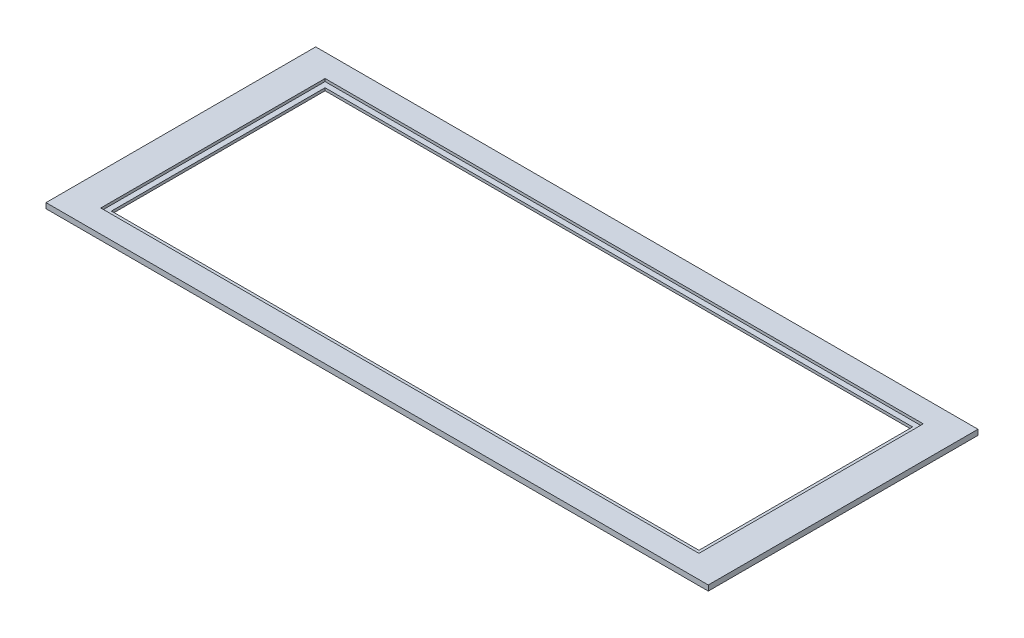
ISO-10303-21;
HEADER;
FILE_DESCRIPTION(('STEP AP214'),'2;1');
FILE_NAME('part.step','',(''),(''),'','','');
FILE_SCHEMA(('AUTOMOTIVE_DESIGN { 1 0 10303 214 1 1 1 1 }'));
ENDSEC;
DATA;
#1=APPLICATION_CONTEXT('core data for automotive mechanical design processes');
#2=APPLICATION_PROTOCOL_DEFINITION('international standard','automotive_design',2000,#1);
#3=PRODUCT_CONTEXT('',#1,'mechanical');
#4=PRODUCT('Part','Part','',(#3));
#5=PRODUCT_RELATED_PRODUCT_CATEGORY('part','',(#4));
#6=PRODUCT_DEFINITION_FORMATION('','',#4);
#7=PRODUCT_DEFINITION_CONTEXT('part definition',#1,'design');
#8=PRODUCT_DEFINITION('design','',#6,#7);
#9=PRODUCT_DEFINITION_SHAPE('','',#8);
#10=(LENGTH_UNIT() NAMED_UNIT(*) SI_UNIT(.MILLI.,.METRE.));
#11=(NAMED_UNIT(*) PLANE_ANGLE_UNIT() SI_UNIT($,.RADIAN.));
#12=(NAMED_UNIT(*) SI_UNIT($,.STERADIAN.) SOLID_ANGLE_UNIT());
#13=UNCERTAINTY_MEASURE_WITH_UNIT(LENGTH_MEASURE(1.E-05),#10,'distance_accuracy_value','');
#14=(GEOMETRIC_REPRESENTATION_CONTEXT(3) GLOBAL_UNCERTAINTY_ASSIGNED_CONTEXT((#13)) GLOBAL_UNIT_ASSIGNED_CONTEXT((#10,
#11,#12)) REPRESENTATION_CONTEXT('',''));
#15=CARTESIAN_POINT('',(0.,0.,0.));
#16=DIRECTION('',(0.,0.,1.));
#17=DIRECTION('',(1.,0.,0.));
#18=AXIS2_PLACEMENT_3D('',#15,#16,#17);
#19=CARTESIAN_POINT('',(-620.,10.,-252.5));
#20=DIRECTION('',(1.,0.,0.));
#21=DIRECTION('',(0.,0.,-1.));
#22=AXIS2_PLACEMENT_3D('',#19,#20,#21);
#23=PLANE('',#22);
#24=DIRECTION('',(0.,0.,1.));
#25=VECTOR('',#24,1.);
#26=CARTESIAN_POINT('',(-620.,0.,-252.5));
#27=LINE('',#26,#25);
#28=CARTESIAN_POINT('',(-620.,0.,-252.5));
#29=VERTEX_POINT('',#28);
#30=CARTESIAN_POINT('',(-620.,0.,252.5));
#31=VERTEX_POINT('',#30);
#32=EDGE_CURVE('E207',#29,#31,#27,.T.);
#33=ORIENTED_EDGE('',*,*,#32,.T.);
#34=DIRECTION('',(0.,-1.,0.));
#35=VECTOR('',#34,1.);
#36=CARTESIAN_POINT('',(-620.,10.,252.5));
#37=LINE('',#36,#35);
#38=CARTESIAN_POINT('',(-620.,10.,252.5));
#39=VERTEX_POINT('',#38);
#40=EDGE_CURVE('E46',#39,#31,#37,.T.);
#41=ORIENTED_EDGE('',*,*,#40,.F.);
#42=DIRECTION('',(0.,0.,1.));
#43=VECTOR('',#42,1.);
#44=CARTESIAN_POINT('',(-620.,10.,-252.5));
#45=LINE('',#44,#43);
#46=CARTESIAN_POINT('',(-620.,10.,-252.5));
#47=VERTEX_POINT('',#46);
#48=EDGE_CURVE('E219',#47,#39,#45,.T.);
#49=ORIENTED_EDGE('',*,*,#48,.F.);
#50=DIRECTION('',(0.,-1.,0.));
#51=VECTOR('',#50,1.);
#52=CARTESIAN_POINT('',(-620.,10.,-252.5));
#53=LINE('',#52,#51);
#54=EDGE_CURVE('E233',#47,#29,#53,.T.);
#55=ORIENTED_EDGE('',*,*,#54,.T.);
#56=EDGE_LOOP('',(#33,#41,#49,#55));
#57=FACE_BOUND('',#56,.T.);
#58=ADVANCED_FACE('F38',(#57),#23,.F.);
#59=CARTESIAN_POINT('',(620.,10.,252.5));
#60=DIRECTION('',(0.,0.,-1.));
#61=DIRECTION('',(-1.,0.,0.));
#62=AXIS2_PLACEMENT_3D('',#59,#60,#61);
#63=PLANE('',#62);
#64=DIRECTION('',(1.,0.,0.));
#65=VECTOR('',#64,1.);
#66=CARTESIAN_POINT('',(620.,0.,252.5));
#67=LINE('',#66,#65);
#68=CARTESIAN_POINT('',(620.,0.,252.5));
#69=VERTEX_POINT('',#68);
#70=EDGE_CURVE('E237',#31,#69,#67,.T.);
#71=ORIENTED_EDGE('',*,*,#70,.T.);
#72=DIRECTION('',(0.,-1.,0.));
#73=VECTOR('',#72,1.);
#74=CARTESIAN_POINT('',(620.,10.,252.5));
#75=LINE('',#74,#73);
#76=CARTESIAN_POINT('',(620.,10.,252.5));
#77=VERTEX_POINT('',#76);
#78=EDGE_CURVE('E252',#77,#69,#75,.T.);
#79=ORIENTED_EDGE('',*,*,#78,.F.);
#80=DIRECTION('',(1.,0.,0.));
#81=VECTOR('',#80,1.);
#82=CARTESIAN_POINT('',(620.,10.,252.5));
#83=LINE('',#82,#81);
#84=EDGE_CURVE('E223',#39,#77,#83,.T.);
#85=ORIENTED_EDGE('',*,*,#84,.F.);
#86=ORIENTED_EDGE('',*,*,#40,.T.);
#87=EDGE_LOOP('',(#71,#79,#85,#86));
#88=FACE_BOUND('',#87,.T.);
#89=ADVANCED_FACE('F259',(#88),#63,.F.);
#90=CARTESIAN_POINT('',(620.,10.,-252.5));
#91=DIRECTION('',(-1.,0.,0.));
#92=DIRECTION('',(0.,0.,1.));
#93=AXIS2_PLACEMENT_3D('',#90,#91,#92);
#94=PLANE('',#93);
#95=DIRECTION('',(0.,0.,-1.));
#96=VECTOR('',#95,1.);
#97=CARTESIAN_POINT('',(620.,0.,-252.5));
#98=LINE('',#97,#96);
#99=CARTESIAN_POINT('',(620.,0.,-252.5));
#100=VERTEX_POINT('',#99);
#101=EDGE_CURVE('E240',#69,#100,#98,.T.);
#102=ORIENTED_EDGE('',*,*,#101,.T.);
#103=DIRECTION('',(0.,-1.,0.));
#104=VECTOR('',#103,1.);
#105=CARTESIAN_POINT('',(620.,10.,-252.5));
#106=LINE('',#105,#104);
#107=CARTESIAN_POINT('',(620.,10.,-252.5));
#108=VERTEX_POINT('',#107);
#109=EDGE_CURVE('E248',#108,#100,#106,.T.);
#110=ORIENTED_EDGE('',*,*,#109,.F.);
#111=DIRECTION('',(0.,0.,-1.));
#112=VECTOR('',#111,1.);
#113=CARTESIAN_POINT('',(620.,10.,-252.5));
#114=LINE('',#113,#112);
#115=EDGE_CURVE('E227',#77,#108,#114,.T.);
#116=ORIENTED_EDGE('',*,*,#115,.F.);
#117=ORIENTED_EDGE('',*,*,#78,.T.);
#118=EDGE_LOOP('',(#102,#110,#116,#117));
#119=FACE_BOUND('',#118,.T.);
#120=ADVANCED_FACE('F271',(#119),#94,.F.);
#121=CARTESIAN_POINT('',(620.,10.,-252.5));
#122=DIRECTION('',(0.,0.,1.));
#123=DIRECTION('',(1.,0.,0.));
#124=AXIS2_PLACEMENT_3D('',#121,#122,#123);
#125=PLANE('',#124);
#126=DIRECTION('',(-1.,0.,0.));
#127=VECTOR('',#126,1.);
#128=CARTESIAN_POINT('',(620.,0.,-252.5));
#129=LINE('',#128,#127);
#130=EDGE_CURVE('E224',#100,#29,#129,.T.);
#131=ORIENTED_EDGE('',*,*,#130,.T.);
#132=ORIENTED_EDGE('',*,*,#54,.F.);
#133=DIRECTION('',(-1.,0.,0.));
#134=VECTOR('',#133,1.);
#135=CARTESIAN_POINT('',(620.,10.,-252.5));
#136=LINE('',#135,#134);
#137=EDGE_CURVE('E230',#108,#47,#136,.T.);
#138=ORIENTED_EDGE('',*,*,#137,.F.);
#139=ORIENTED_EDGE('',*,*,#109,.T.);
#140=EDGE_LOOP('',(#131,#132,#138,#139));
#141=FACE_BOUND('',#140,.T.);
#142=ADVANCED_FACE('F275',(#141),#125,.F.);
#143=CARTESIAN_POINT('',(0.,10.,0.));
#144=DIRECTION('',(0.,-1.,0.));
#145=DIRECTION('',(0.,0.,-1.));
#146=AXIS2_PLACEMENT_3D('',#143,#144,#145);
#147=PLANE('',#146);
#148=DIRECTION('',(1.,0.,0.));
#149=VECTOR('',#148,1.);
#150=CARTESIAN_POINT('',(560.,10.,210.));
#151=LINE('',#150,#149);
#152=CARTESIAN_POINT('',(-560.,10.,210.));
#153=VERTEX_POINT('',#152);
#154=CARTESIAN_POINT('',(560.,10.,210.));
#155=VERTEX_POINT('',#154);
#156=EDGE_CURVE('E162',#153,#155,#151,.T.);
#157=ORIENTED_EDGE('',*,*,#156,.F.);
#158=DIRECTION('',(0.,0.,1.));
#159=VECTOR('',#158,1.);
#160=CARTESIAN_POINT('',(-560.,10.,-210.));
#161=LINE('',#160,#159);
#162=CARTESIAN_POINT('',(-560.,10.,-210.));
#163=VERTEX_POINT('',#162);
#164=EDGE_CURVE('E53',#163,#153,#161,.T.);
#165=ORIENTED_EDGE('',*,*,#164,.F.);
#166=DIRECTION('',(-1.,0.,0.));
#167=VECTOR('',#166,1.);
#168=CARTESIAN_POINT('',(560.,10.,-210.));
#169=LINE('',#168,#167);
#170=CARTESIAN_POINT('',(560.,10.,-210.));
#171=VERTEX_POINT('',#170);
#172=EDGE_CURVE('E149',#171,#163,#169,.T.);
#173=ORIENTED_EDGE('',*,*,#172,.F.);
#174=DIRECTION('',(0.,0.,-1.));
#175=VECTOR('',#174,1.);
#176=CARTESIAN_POINT('',(560.,10.,-210.));
#177=LINE('',#176,#175);
#178=EDGE_CURVE('E153',#155,#171,#177,.T.);
#179=ORIENTED_EDGE('',*,*,#178,.F.);
#180=EDGE_LOOP('',(#157,#165,#173,#179));
#181=FACE_BOUND('',#180,.T.);
#182=ORIENTED_EDGE('',*,*,#48,.T.);
#183=ORIENTED_EDGE('',*,*,#84,.T.);
#184=ORIENTED_EDGE('',*,*,#115,.T.);
#185=ORIENTED_EDGE('',*,*,#137,.T.);
#186=EDGE_LOOP('',(#182,#183,#184,#185));
#187=FACE_BOUND('',#186,.T.);
#188=ADVANCED_FACE('F277',(#181,#187),#147,.F.);
#189=CARTESIAN_POINT('',(0.,0.,0.));
#190=DIRECTION('',(0.,-1.,0.));
#191=DIRECTION('',(0.,0.,-1.));
#192=AXIS2_PLACEMENT_3D('',#189,#190,#191);
#193=PLANE('',#192);
#194=DIRECTION('',(0.,0.,1.));
#195=VECTOR('',#194,1.);
#196=CARTESIAN_POINT('',(-550.,0.,-200.));
#197=LINE('',#196,#195);
#198=CARTESIAN_POINT('',(-550.,0.,-200.));
#199=VERTEX_POINT('',#198);
#200=CARTESIAN_POINT('',(-550.,0.,200.));
#201=VERTEX_POINT('',#200);
#202=EDGE_CURVE('E186',#199,#201,#197,.T.);
#203=ORIENTED_EDGE('',*,*,#202,.T.);
#204=DIRECTION('',(1.,0.,0.));
#205=VECTOR('',#204,1.);
#206=CARTESIAN_POINT('',(550.,0.,200.));
#207=LINE('',#206,#205);
#208=CARTESIAN_POINT('',(550.,0.,200.));
#209=VERTEX_POINT('',#208);
#210=EDGE_CURVE('E190',#201,#209,#207,.T.);
#211=ORIENTED_EDGE('',*,*,#210,.T.);
#212=DIRECTION('',(0.,0.,-1.));
#213=VECTOR('',#212,1.);
#214=CARTESIAN_POINT('',(550.,0.,-200.));
#215=LINE('',#214,#213);
#216=CARTESIAN_POINT('',(550.,0.,-200.));
#217=VERTEX_POINT('',#216);
#218=EDGE_CURVE('E194',#209,#217,#215,.T.);
#219=ORIENTED_EDGE('',*,*,#218,.T.);
#220=DIRECTION('',(-1.,0.,0.));
#221=VECTOR('',#220,1.);
#222=CARTESIAN_POINT('',(550.,0.,-200.));
#223=LINE('',#222,#221);
#224=EDGE_CURVE('E198',#217,#199,#223,.T.);
#225=ORIENTED_EDGE('',*,*,#224,.T.);
#226=EDGE_LOOP('',(#203,#211,#219,#225));
#227=FACE_BOUND('',#226,.T.);
#228=ORIENTED_EDGE('',*,*,#32,.F.);
#229=ORIENTED_EDGE('',*,*,#130,.F.);
#230=ORIENTED_EDGE('',*,*,#101,.F.);
#231=ORIENTED_EDGE('',*,*,#70,.F.);
#232=EDGE_LOOP('',(#228,#229,#230,#231));
#233=FACE_BOUND('',#232,.T.);
#234=ADVANCED_FACE('F267',(#227,#233),#193,.T.);
#235=CARTESIAN_POINT('',(-550.,0.,-200.));
#236=DIRECTION('',(-1.,0.,0.));
#237=DIRECTION('',(0.,0.,1.));
#238=AXIS2_PLACEMENT_3D('',#235,#236,#237);
#239=PLANE('',#238);
#240=DIRECTION('',(0.,1.,0.));
#241=VECTOR('',#240,1.);
#242=CARTESIAN_POINT('',(-550.,0.,-200.));
#243=LINE('',#242,#241);
#244=CARTESIAN_POINT('',(-550.,5.,-200.));
#245=VERTEX_POINT('',#244);
#246=EDGE_CURVE('E203',#199,#245,#243,.T.);
#247=ORIENTED_EDGE('',*,*,#246,.T.);
#248=DIRECTION('',(0.,0.,1.));
#249=VECTOR('',#248,1.);
#250=CARTESIAN_POINT('',(-550.,5.,-200.));
#251=LINE('',#250,#249);
#252=CARTESIAN_POINT('',(-550.,5.,200.));
#253=VERTEX_POINT('',#252);
#254=EDGE_CURVE('E182',#245,#253,#251,.T.);
#255=ORIENTED_EDGE('',*,*,#254,.T.);
#256=DIRECTION('',(0.,1.,0.));
#257=VECTOR('',#256,1.);
#258=CARTESIAN_POINT('',(-550.,0.,200.));
#259=LINE('',#258,#257);
#260=EDGE_CURVE('E202',#201,#253,#259,.T.);
#261=ORIENTED_EDGE('',*,*,#260,.F.);
#262=ORIENTED_EDGE('',*,*,#202,.F.);
#263=EDGE_LOOP('',(#247,#255,#261,#262));
#264=FACE_BOUND('',#263,.T.);
#265=ADVANCED_FACE('F286',(#264),#239,.F.);
#266=CARTESIAN_POINT('',(550.,0.,-200.));
#267=DIRECTION('',(0.,0.,-1.));
#268=DIRECTION('',(-1.,0.,0.));
#269=AXIS2_PLACEMENT_3D('',#266,#267,#268);
#270=PLANE('',#269);
#271=DIRECTION('',(0.,1.,0.));
#272=VECTOR('',#271,1.);
#273=CARTESIAN_POINT('',(550.,0.,-200.));
#274=LINE('',#273,#272);
#275=CARTESIAN_POINT('',(550.,5.,-200.));
#276=VERTEX_POINT('',#275);
#277=EDGE_CURVE('E208',#217,#276,#274,.T.);
#278=ORIENTED_EDGE('',*,*,#277,.T.);
#279=DIRECTION('',(-1.,0.,0.));
#280=VECTOR('',#279,1.);
#281=CARTESIAN_POINT('',(550.,5.,-200.));
#282=LINE('',#281,#280);
#283=EDGE_CURVE('E178',#276,#245,#282,.T.);
#284=ORIENTED_EDGE('',*,*,#283,.T.);
#285=ORIENTED_EDGE('',*,*,#246,.F.);
#286=ORIENTED_EDGE('',*,*,#224,.F.);
#287=EDGE_LOOP('',(#278,#284,#285,#286));
#288=FACE_BOUND('',#287,.T.);
#289=ADVANCED_FACE('F319',(#288),#270,.F.);
#290=CARTESIAN_POINT('',(550.,0.,-200.));
#291=DIRECTION('',(1.,0.,0.));
#292=DIRECTION('',(0.,0.,-1.));
#293=AXIS2_PLACEMENT_3D('',#290,#291,#292);
#294=PLANE('',#293);
#295=DIRECTION('',(0.,1.,0.));
#296=VECTOR('',#295,1.);
#297=CARTESIAN_POINT('',(550.,0.,200.));
#298=LINE('',#297,#296);
#299=CARTESIAN_POINT('',(550.,5.,200.));
#300=VERTEX_POINT('',#299);
#301=EDGE_CURVE('E212',#209,#300,#298,.T.);
#302=ORIENTED_EDGE('',*,*,#301,.T.);
#303=DIRECTION('',(0.,0.,-1.));
#304=VECTOR('',#303,1.);
#305=CARTESIAN_POINT('',(550.,5.,-200.));
#306=LINE('',#305,#304);
#307=EDGE_CURVE('E61',#300,#276,#306,.T.);
#308=ORIENTED_EDGE('',*,*,#307,.T.);
#309=ORIENTED_EDGE('',*,*,#277,.F.);
#310=ORIENTED_EDGE('',*,*,#218,.F.);
#311=EDGE_LOOP('',(#302,#308,#309,#310));
#312=FACE_BOUND('',#311,.T.);
#313=ADVANCED_FACE('F328',(#312),#294,.F.);
#314=CARTESIAN_POINT('',(550.,0.,200.));
#315=DIRECTION('',(0.,0.,1.));
#316=DIRECTION('',(1.,0.,0.));
#317=AXIS2_PLACEMENT_3D('',#314,#315,#316);
#318=PLANE('',#317);
#319=ORIENTED_EDGE('',*,*,#260,.T.);
#320=DIRECTION('',(1.,0.,0.));
#321=VECTOR('',#320,1.);
#322=CARTESIAN_POINT('',(550.,5.,200.));
#323=LINE('',#322,#321);
#324=EDGE_CURVE('E11',#253,#300,#323,.T.);
#325=ORIENTED_EDGE('',*,*,#324,.T.);
#326=ORIENTED_EDGE('',*,*,#301,.F.);
#327=ORIENTED_EDGE('',*,*,#210,.F.);
#328=EDGE_LOOP('',(#319,#325,#326,#327));
#329=FACE_BOUND('',#328,.T.);
#330=ADVANCED_FACE('F338',(#329),#318,.F.);
#331=CARTESIAN_POINT('',(0.,5.,0.));
#332=DIRECTION('',(0.,-1.,0.));
#333=DIRECTION('',(0.,0.,-1.));
#334=AXIS2_PLACEMENT_3D('',#331,#332,#333);
#335=PLANE('',#334);
#336=DIRECTION('',(0.,0.,1.));
#337=VECTOR('',#336,1.);
#338=CARTESIAN_POINT('',(-560.,5.,-210.));
#339=LINE('',#338,#337);
#340=CARTESIAN_POINT('',(-560.,5.,-210.));
#341=VERTEX_POINT('',#340);
#342=CARTESIAN_POINT('',(-560.,5.,210.));
#343=VERTEX_POINT('',#342);
#344=EDGE_CURVE('E128',#341,#343,#339,.T.);
#345=ORIENTED_EDGE('',*,*,#344,.T.);
#346=DIRECTION('',(1.,0.,0.));
#347=VECTOR('',#346,1.);
#348=CARTESIAN_POINT('',(560.,5.,210.));
#349=LINE('',#348,#347);
#350=CARTESIAN_POINT('',(560.,5.,210.));
#351=VERTEX_POINT('',#350);
#352=EDGE_CURVE('E138',#343,#351,#349,.T.);
#353=ORIENTED_EDGE('',*,*,#352,.T.);
#354=DIRECTION('',(0.,0.,-1.));
#355=VECTOR('',#354,1.);
#356=CARTESIAN_POINT('',(560.,5.,-210.));
#357=LINE('',#356,#355);
#358=CARTESIAN_POINT('',(560.,5.,-210.));
#359=VERTEX_POINT('',#358);
#360=EDGE_CURVE('E144',#351,#359,#357,.T.);
#361=ORIENTED_EDGE('',*,*,#360,.T.);
#362=DIRECTION('',(-1.,0.,0.));
#363=VECTOR('',#362,1.);
#364=CARTESIAN_POINT('',(560.,5.,-210.));
#365=LINE('',#364,#363);
#366=EDGE_CURVE('E135',#359,#341,#365,.T.);
#367=ORIENTED_EDGE('',*,*,#366,.T.);
#368=EDGE_LOOP('',(#345,#353,#361,#367));
#369=FACE_BOUND('',#368,.T.);
#370=ORIENTED_EDGE('',*,*,#283,.F.);
#371=ORIENTED_EDGE('',*,*,#307,.F.);
#372=ORIENTED_EDGE('',*,*,#324,.F.);
#373=ORIENTED_EDGE('',*,*,#254,.F.);
#374=EDGE_LOOP('',(#370,#371,#372,#373));
#375=FACE_BOUND('',#374,.T.);
#376=ADVANCED_FACE('F146',(#369,#375),#335,.F.);
#377=CARTESIAN_POINT('',(-560.,5.,-210.));
#378=DIRECTION('',(-1.,0.,0.));
#379=DIRECTION('',(0.,0.,1.));
#380=AXIS2_PLACEMENT_3D('',#377,#378,#379);
#381=PLANE('',#380);
#382=ORIENTED_EDGE('',*,*,#164,.T.);
#383=DIRECTION('',(0.,1.,0.));
#384=VECTOR('',#383,1.);
#385=CARTESIAN_POINT('',(-560.,5.,210.));
#386=LINE('',#385,#384);
#387=EDGE_CURVE('E124',#343,#153,#386,.T.);
#388=ORIENTED_EDGE('',*,*,#387,.F.);
#389=ORIENTED_EDGE('',*,*,#344,.F.);
#390=DIRECTION('',(0.,1.,0.));
#391=VECTOR('',#390,1.);
#392=CARTESIAN_POINT('',(-560.,5.,-210.));
#393=LINE('',#392,#391);
#394=EDGE_CURVE('E168',#341,#163,#393,.T.);
#395=ORIENTED_EDGE('',*,*,#394,.T.);
#396=EDGE_LOOP('',(#382,#388,#389,#395));
#397=FACE_BOUND('',#396,.T.);
#398=ADVANCED_FACE('F126',(#397),#381,.F.);
#399=CARTESIAN_POINT('',(560.,5.,-210.));
#400=DIRECTION('',(0.,0.,-1.));
#401=DIRECTION('',(-1.,0.,0.));
#402=AXIS2_PLACEMENT_3D('',#399,#400,#401);
#403=PLANE('',#402);
#404=ORIENTED_EDGE('',*,*,#172,.T.);
#405=ORIENTED_EDGE('',*,*,#394,.F.);
#406=ORIENTED_EDGE('',*,*,#366,.F.);
#407=DIRECTION('',(0.,1.,0.));
#408=VECTOR('',#407,1.);
#409=CARTESIAN_POINT('',(560.,5.,-210.));
#410=LINE('',#409,#408);
#411=EDGE_CURVE('E171',#359,#171,#410,.T.);
#412=ORIENTED_EDGE('',*,*,#411,.T.);
#413=EDGE_LOOP('',(#404,#405,#406,#412));
#414=FACE_BOUND('',#413,.T.);
#415=ADVANCED_FACE('F362',(#414),#403,.F.);
#416=CARTESIAN_POINT('',(560.,5.,-210.));
#417=DIRECTION('',(1.,0.,0.));
#418=DIRECTION('',(0.,0.,-1.));
#419=AXIS2_PLACEMENT_3D('',#416,#417,#418);
#420=PLANE('',#419);
#421=ORIENTED_EDGE('',*,*,#178,.T.);
#422=ORIENTED_EDGE('',*,*,#411,.F.);
#423=ORIENTED_EDGE('',*,*,#360,.F.);
#424=DIRECTION('',(0.,1.,0.));
#425=VECTOR('',#424,1.);
#426=CARTESIAN_POINT('',(560.,5.,210.));
#427=LINE('',#426,#425);
#428=EDGE_CURVE('E134',#351,#155,#427,.T.);
#429=ORIENTED_EDGE('',*,*,#428,.T.);
#430=EDGE_LOOP('',(#421,#422,#423,#429));
#431=FACE_BOUND('',#430,.T.);
#432=ADVANCED_FACE('F369',(#431),#420,.F.);
#433=CARTESIAN_POINT('',(560.,5.,210.));
#434=DIRECTION('',(0.,0.,1.));
#435=DIRECTION('',(1.,0.,0.));
#436=AXIS2_PLACEMENT_3D('',#433,#434,#435);
#437=PLANE('',#436);
#438=ORIENTED_EDGE('',*,*,#156,.T.);
#439=ORIENTED_EDGE('',*,*,#428,.F.);
#440=ORIENTED_EDGE('',*,*,#352,.F.);
#441=ORIENTED_EDGE('',*,*,#387,.T.);
#442=EDGE_LOOP('',(#438,#439,#440,#441));
#443=FACE_BOUND('',#442,.T.);
#444=ADVANCED_FACE('F139',(#443),#437,.F.);
#445=CLOSED_SHELL('',(#58,#89,#120,#142,#188,#234,#265,#289,#313,#330,#376,#398,#415,#432,#444));
#446=MANIFOLD_SOLID_BREP('B2',#445);
#447=ADVANCED_BREP_SHAPE_REPRESENTATION('',(#18,#446),#14);
#448=SHAPE_DEFINITION_REPRESENTATION(#9,#447);
ENDSEC;
END-ISO-10303-21;
